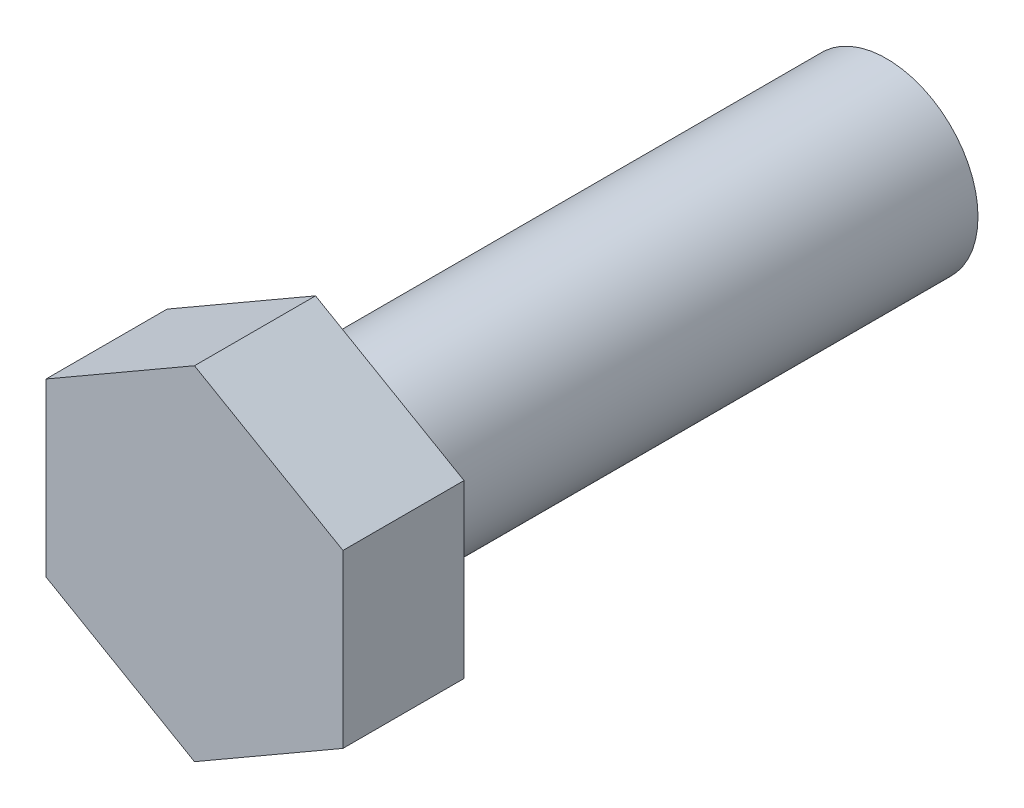
ISO-10303-21;
HEADER;
FILE_DESCRIPTION(('STEP AP214'),'2;1');
FILE_NAME('part.step','',(''),(''),'','','');
FILE_SCHEMA(('AUTOMOTIVE_DESIGN { 1 0 10303 214 1 1 1 1 }'));
ENDSEC;
DATA;
#1=APPLICATION_CONTEXT('core data for automotive mechanical design processes');
#2=APPLICATION_PROTOCOL_DEFINITION('international standard','automotive_design',2000,#1);
#3=PRODUCT_CONTEXT('',#1,'mechanical');
#4=PRODUCT('Part','Part','',(#3));
#5=PRODUCT_RELATED_PRODUCT_CATEGORY('part','',(#4));
#6=PRODUCT_DEFINITION_FORMATION('','',#4);
#7=PRODUCT_DEFINITION_CONTEXT('part definition',#1,'design');
#8=PRODUCT_DEFINITION('design','',#6,#7);
#9=PRODUCT_DEFINITION_SHAPE('','',#8);
#10=(LENGTH_UNIT() NAMED_UNIT(*) SI_UNIT(.MILLI.,.METRE.));
#11=(NAMED_UNIT(*) PLANE_ANGLE_UNIT() SI_UNIT($,.RADIAN.));
#12=(NAMED_UNIT(*) SI_UNIT($,.STERADIAN.) SOLID_ANGLE_UNIT());
#13=UNCERTAINTY_MEASURE_WITH_UNIT(LENGTH_MEASURE(1.E-05),#10,'distance_accuracy_value','');
#14=(GEOMETRIC_REPRESENTATION_CONTEXT(3) GLOBAL_UNCERTAINTY_ASSIGNED_CONTEXT((#13)) GLOBAL_UNIT_ASSIGNED_CONTEXT((#10,
#11,#12)) REPRESENTATION_CONTEXT('',''));
#15=CARTESIAN_POINT('',(0.,0.,0.));
#16=DIRECTION('',(0.,0.,1.));
#17=DIRECTION('',(1.,0.,0.));
#18=AXIS2_PLACEMENT_3D('',#15,#16,#17);
#19=CARTESIAN_POINT('',(0.,0.,0.));
#20=DIRECTION('',(0.,0.,1.));
#21=DIRECTION('',(1.,0.,0.));
#22=AXIS2_PLACEMENT_3D('',#19,#20,#21);
#23=PLANE('',#22);
#24=DIRECTION('',(-0.866025403784439,0.5,0.));
#25=VECTOR('',#24,1.);
#26=CARTESIAN_POINT('',(6.5,3.75277674973257,0.));
#27=LINE('',#26,#25);
#28=CARTESIAN_POINT('',(6.5,3.75277674973257,0.));
#29=VERTEX_POINT('',#28);
#30=CARTESIAN_POINT('',(0.,7.50555349946513,0.));
#31=VERTEX_POINT('',#30);
#32=EDGE_CURVE('E120',#29,#31,#27,.T.);
#33=ORIENTED_EDGE('',*,*,#32,.F.);
#34=DIRECTION('',(0.,1.,0.));
#35=VECTOR('',#34,1.);
#36=CARTESIAN_POINT('',(6.5,-3.75277674973257,0.));
#37=LINE('',#36,#35);
#38=CARTESIAN_POINT('',(6.5,-3.75277674973257,0.));
#39=VERTEX_POINT('',#38);
#40=EDGE_CURVE('E80',#39,#29,#37,.T.);
#41=ORIENTED_EDGE('',*,*,#40,.F.);
#42=DIRECTION('',(0.866025403784439,0.5,0.));
#43=VECTOR('',#42,1.);
#44=CARTESIAN_POINT('',(0.,-7.50555349946513,0.));
#45=LINE('',#44,#43);
#46=CARTESIAN_POINT('',(0.,-7.50555349946513,0.));
#47=VERTEX_POINT('',#46);
#48=EDGE_CURVE('E74',#47,#39,#45,.T.);
#49=ORIENTED_EDGE('',*,*,#48,.F.);
#50=DIRECTION('',(0.866025403784439,-0.5,0.));
#51=VECTOR('',#50,1.);
#52=CARTESIAN_POINT('',(-6.5,-3.75277674973257,0.));
#53=LINE('',#52,#51);
#54=CARTESIAN_POINT('',(-6.5,-3.75277674973257,0.));
#55=VERTEX_POINT('',#54);
#56=EDGE_CURVE('E110',#55,#47,#53,.T.);
#57=ORIENTED_EDGE('',*,*,#56,.F.);
#58=DIRECTION('',(0.,-1.,0.));
#59=VECTOR('',#58,1.);
#60=CARTESIAN_POINT('',(-6.5,3.75277674973257,0.));
#61=LINE('',#60,#59);
#62=CARTESIAN_POINT('',(-6.5,3.75277674973257,0.));
#63=VERTEX_POINT('',#62);
#64=EDGE_CURVE('E126',#63,#55,#61,.T.);
#65=ORIENTED_EDGE('',*,*,#64,.F.);
#66=DIRECTION('',(-0.866025403784439,-0.5,0.));
#67=VECTOR('',#66,1.);
#68=CARTESIAN_POINT('',(0.,7.50555349946513,0.));
#69=LINE('',#68,#67);
#70=EDGE_CURVE('E123',#31,#63,#69,.T.);
#71=ORIENTED_EDGE('',*,*,#70,.F.);
#72=EDGE_LOOP('',(#33,#41,#49,#57,#65,#71));
#73=FACE_BOUND('',#72,.T.);
#74=CARTESIAN_POINT('',(0.,0.,0.));
#75=DIRECTION('',(0.,0.,1.));
#76=DIRECTION('',(1.,0.,0.));
#77=AXIS2_PLACEMENT_3D('',#74,#75,#76);
#78=CIRCLE('',#77,4.);
#79=CARTESIAN_POINT('',(4.,0.,0.));
#80=VERTEX_POINT('',#79);
#81=EDGE_CURVE('E11',#80,#80,#78,.F.);
#82=ORIENTED_EDGE('',*,*,#81,.F.);
#83=EDGE_LOOP('',(#82));
#84=FACE_BOUND('',#83,.T.);
#85=ADVANCED_FACE('F34',(#73,#84),#23,.F.);
#86=CARTESIAN_POINT('',(6.5,3.75277674973257,5.3));
#87=DIRECTION('',(-0.5,-0.866025403784439,0.));
#88=DIRECTION('',(0.866025403784439,-0.5,0.));
#89=AXIS2_PLACEMENT_3D('',#86,#87,#88);
#90=PLANE('',#89);
#91=ORIENTED_EDGE('',*,*,#32,.T.);
#92=DIRECTION('',(0.,0.,-1.));
#93=VECTOR('',#92,1.);
#94=CARTESIAN_POINT('',(0.,7.50555349946513,5.3));
#95=LINE('',#94,#93);
#96=CARTESIAN_POINT('',(0.,7.50555349946513,5.3));
#97=VERTEX_POINT('',#96);
#98=EDGE_CURVE('E43',#97,#31,#95,.T.);
#99=ORIENTED_EDGE('',*,*,#98,.F.);
#100=DIRECTION('',(-0.866025403784439,0.5,0.));
#101=VECTOR('',#100,1.);
#102=CARTESIAN_POINT('',(6.5,3.75277674973257,5.3));
#103=LINE('',#102,#101);
#104=CARTESIAN_POINT('',(6.5,3.75277674973257,5.3));
#105=VERTEX_POINT('',#104);
#106=EDGE_CURVE('E131',#105,#97,#103,.T.);
#107=ORIENTED_EDGE('',*,*,#106,.F.);
#108=DIRECTION('',(0.,0.,-1.));
#109=VECTOR('',#108,1.);
#110=CARTESIAN_POINT('',(6.5,3.75277674973257,5.3));
#111=LINE('',#110,#109);
#112=EDGE_CURVE('E116',#105,#29,#111,.T.);
#113=ORIENTED_EDGE('',*,*,#112,.T.);
#114=EDGE_LOOP('',(#91,#99,#107,#113));
#115=FACE_BOUND('',#114,.T.);
#116=ADVANCED_FACE('F36',(#115),#90,.F.);
#117=CARTESIAN_POINT('',(0.,7.50555349946513,5.3));
#118=DIRECTION('',(0.5,-0.866025403784439,0.));
#119=DIRECTION('',(0.866025403784439,0.5,0.));
#120=AXIS2_PLACEMENT_3D('',#117,#118,#119);
#121=PLANE('',#120);
#122=ORIENTED_EDGE('',*,*,#70,.T.);
#123=DIRECTION('',(0.,0.,-1.));
#124=VECTOR('',#123,1.);
#125=CARTESIAN_POINT('',(-6.5,3.75277674973257,5.3));
#126=LINE('',#125,#124);
#127=CARTESIAN_POINT('',(-6.5,3.75277674973257,5.3));
#128=VERTEX_POINT('',#127);
#129=EDGE_CURVE('E135',#128,#63,#126,.T.);
#130=ORIENTED_EDGE('',*,*,#129,.F.);
#131=DIRECTION('',(-0.866025403784439,-0.5,0.));
#132=VECTOR('',#131,1.);
#133=CARTESIAN_POINT('',(0.,7.50555349946513,5.3));
#134=LINE('',#133,#132);
#135=EDGE_CURVE('E89',#97,#128,#134,.T.);
#136=ORIENTED_EDGE('',*,*,#135,.F.);
#137=ORIENTED_EDGE('',*,*,#98,.T.);
#138=EDGE_LOOP('',(#122,#130,#136,#137));
#139=FACE_BOUND('',#138,.T.);
#140=ADVANCED_FACE('F138',(#139),#121,.F.);
#141=CARTESIAN_POINT('',(-6.5,3.75277674973257,5.3));
#142=DIRECTION('',(1.,0.,0.));
#143=DIRECTION('',(0.,0.,-1.));
#144=AXIS2_PLACEMENT_3D('',#141,#142,#143);
#145=PLANE('',#144);
#146=ORIENTED_EDGE('',*,*,#64,.T.);
#147=DIRECTION('',(0.,0.,-1.));
#148=VECTOR('',#147,1.);
#149=CARTESIAN_POINT('',(-6.5,-3.75277674973257,5.3));
#150=LINE('',#149,#148);
#151=CARTESIAN_POINT('',(-6.5,-3.75277674973257,5.3));
#152=VERTEX_POINT('',#151);
#153=EDGE_CURVE('E111',#152,#55,#150,.T.);
#154=ORIENTED_EDGE('',*,*,#153,.F.);
#155=DIRECTION('',(0.,-1.,0.));
#156=VECTOR('',#155,1.);
#157=CARTESIAN_POINT('',(-6.5,3.75277674973257,5.3));
#158=LINE('',#157,#156);
#159=EDGE_CURVE('E102',#128,#152,#158,.T.);
#160=ORIENTED_EDGE('',*,*,#159,.F.);
#161=ORIENTED_EDGE('',*,*,#129,.T.);
#162=EDGE_LOOP('',(#146,#154,#160,#161));
#163=FACE_BOUND('',#162,.T.);
#164=ADVANCED_FACE('F146',(#163),#145,.F.);
#165=CARTESIAN_POINT('',(-6.5,-3.75277674973257,5.3));
#166=DIRECTION('',(0.5,0.866025403784439,0.));
#167=DIRECTION('',(-0.866025403784439,0.5,0.));
#168=AXIS2_PLACEMENT_3D('',#165,#166,#167);
#169=PLANE('',#168);
#170=ORIENTED_EDGE('',*,*,#56,.T.);
#171=DIRECTION('',(0.,0.,-1.));
#172=VECTOR('',#171,1.);
#173=CARTESIAN_POINT('',(0.,-7.50555349946513,5.3));
#174=LINE('',#173,#172);
#175=CARTESIAN_POINT('',(0.,-7.50555349946513,5.3));
#176=VERTEX_POINT('',#175);
#177=EDGE_CURVE('E107',#176,#47,#174,.T.);
#178=ORIENTED_EDGE('',*,*,#177,.F.);
#179=DIRECTION('',(0.866025403784439,-0.5,0.));
#180=VECTOR('',#179,1.);
#181=CARTESIAN_POINT('',(-6.5,-3.75277674973257,5.3));
#182=LINE('',#181,#180);
#183=EDGE_CURVE('E96',#152,#176,#182,.T.);
#184=ORIENTED_EDGE('',*,*,#183,.F.);
#185=ORIENTED_EDGE('',*,*,#153,.T.);
#186=EDGE_LOOP('',(#170,#178,#184,#185));
#187=FACE_BOUND('',#186,.T.);
#188=ADVANCED_FACE('F108',(#187),#169,.F.);
#189=CARTESIAN_POINT('',(0.,-7.50555349946513,5.3));
#190=DIRECTION('',(-0.5,0.866025403784439,0.));
#191=DIRECTION('',(-0.866025403784439,-0.5,0.));
#192=AXIS2_PLACEMENT_3D('',#189,#190,#191);
#193=PLANE('',#192);
#194=ORIENTED_EDGE('',*,*,#48,.T.);
#195=DIRECTION('',(0.,0.,-1.));
#196=VECTOR('',#195,1.);
#197=CARTESIAN_POINT('',(6.5,-3.75277674973257,5.3));
#198=LINE('',#197,#196);
#199=CARTESIAN_POINT('',(6.5,-3.75277674973257,5.3));
#200=VERTEX_POINT('',#199);
#201=EDGE_CURVE('E112',#200,#39,#198,.T.);
#202=ORIENTED_EDGE('',*,*,#201,.F.);
#203=DIRECTION('',(0.866025403784439,0.5,0.));
#204=VECTOR('',#203,1.);
#205=CARTESIAN_POINT('',(0.,-7.50555349946513,5.3));
#206=LINE('',#205,#204);
#207=EDGE_CURVE('E100',#176,#200,#206,.T.);
#208=ORIENTED_EDGE('',*,*,#207,.F.);
#209=ORIENTED_EDGE('',*,*,#177,.T.);
#210=EDGE_LOOP('',(#194,#202,#208,#209));
#211=FACE_BOUND('',#210,.T.);
#212=ADVANCED_FACE('F114',(#211),#193,.F.);
#213=CARTESIAN_POINT('',(6.5,-3.75277674973257,5.3));
#214=DIRECTION('',(-1.,0.,0.));
#215=DIRECTION('',(0.,-1.,0.));
#216=AXIS2_PLACEMENT_3D('',#213,#214,#215);
#217=PLANE('',#216);
#218=ORIENTED_EDGE('',*,*,#40,.T.);
#219=ORIENTED_EDGE('',*,*,#112,.F.);
#220=DIRECTION('',(0.,1.,0.));
#221=VECTOR('',#220,1.);
#222=CARTESIAN_POINT('',(6.5,-3.75277674973257,5.3));
#223=LINE('',#222,#221);
#224=EDGE_CURVE('E51',#200,#105,#223,.T.);
#225=ORIENTED_EDGE('',*,*,#224,.F.);
#226=ORIENTED_EDGE('',*,*,#201,.T.);
#227=EDGE_LOOP('',(#218,#219,#225,#226));
#228=FACE_BOUND('',#227,.T.);
#229=ADVANCED_FACE('F167',(#228),#217,.F.);
#230=CARTESIAN_POINT('',(0.,0.,5.3));
#231=DIRECTION('',(0.,0.,1.));
#232=DIRECTION('',(1.,0.,0.));
#233=AXIS2_PLACEMENT_3D('',#230,#231,#232);
#234=PLANE('',#233);
#235=ORIENTED_EDGE('',*,*,#106,.T.);
#236=ORIENTED_EDGE('',*,*,#135,.T.);
#237=ORIENTED_EDGE('',*,*,#159,.T.);
#238=ORIENTED_EDGE('',*,*,#183,.T.);
#239=ORIENTED_EDGE('',*,*,#207,.T.);
#240=ORIENTED_EDGE('',*,*,#224,.T.);
#241=EDGE_LOOP('',(#235,#236,#237,#238,#239,#240));
#242=FACE_BOUND('',#241,.T.);
#243=ADVANCED_FACE('F98',(#242),#234,.T.);
#244=CARTESIAN_POINT('',(0.,0.,-25.));
#245=DIRECTION('',(0.,0.,1.));
#246=DIRECTION('',(1.,0.,0.));
#247=AXIS2_PLACEMENT_3D('',#244,#245,#246);
#248=CYLINDRICAL_SURFACE('',#247,4.);
#249=CARTESIAN_POINT('',(0.,0.,-25.));
#250=DIRECTION('',(0.,0.,-1.));
#251=DIRECTION('',(-1.,0.,0.));
#252=AXIS2_PLACEMENT_3D('',#249,#250,#251);
#253=CIRCLE('',#252,4.);
#254=CARTESIAN_POINT('',(-4.,0.,-25.));
#255=VERTEX_POINT('',#254);
#256=EDGE_CURVE('E124',#255,#255,#253,.T.);
#257=ORIENTED_EDGE('',*,*,#256,.F.);
#258=EDGE_LOOP('',(#257));
#259=FACE_BOUND('',#258,.T.);
#260=ORIENTED_EDGE('',*,*,#81,.T.);
#261=EDGE_LOOP('',(#260));
#262=FACE_BOUND('',#261,.T.);
#263=ADVANCED_FACE('F155',(#259,#262),#248,.T.);
#264=CARTESIAN_POINT('',(0.,0.,-25.));
#265=DIRECTION('',(0.,0.,-1.));
#266=DIRECTION('',(-1.,0.,0.));
#267=AXIS2_PLACEMENT_3D('',#264,#265,#266);
#268=PLANE('',#267);
#269=ORIENTED_EDGE('',*,*,#256,.T.);
#270=EDGE_LOOP('',(#269));
#271=FACE_BOUND('',#270,.T.);
#272=ADVANCED_FACE('F153',(#271),#268,.T.);
#273=CLOSED_SHELL('',(#85,#116,#140,#164,#188,#212,#229,#243,#263,#272));
#274=MANIFOLD_SOLID_BREP('B2',#273);
#275=ADVANCED_BREP_SHAPE_REPRESENTATION('',(#18,#274),#14);
#276=SHAPE_DEFINITION_REPRESENTATION(#9,#275);
ENDSEC;
END-ISO-10303-21;
